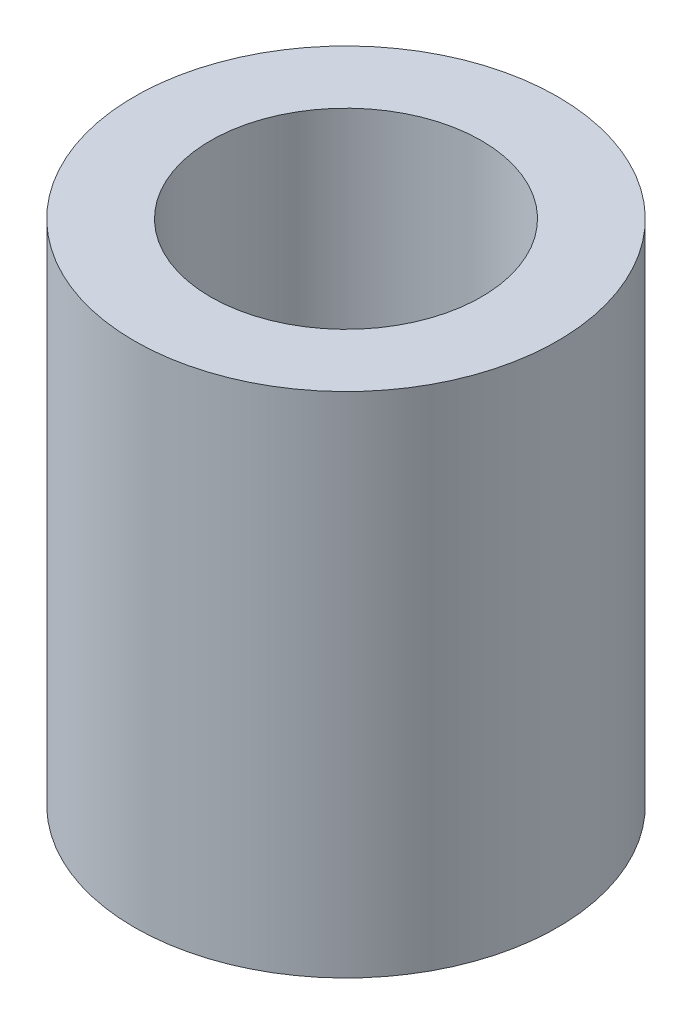
ISO-10303-21;
HEADER;
FILE_DESCRIPTION(('STEP AP214'),'2;1');
FILE_NAME('part.step','',(''),(''),'','','');
FILE_SCHEMA(('AUTOMOTIVE_DESIGN { 1 0 10303 214 1 1 1 1 }'));
ENDSEC;
DATA;
#1=APPLICATION_CONTEXT('core data for automotive mechanical design processes');
#2=APPLICATION_PROTOCOL_DEFINITION('international standard','automotive_design',2000,#1);
#3=PRODUCT_CONTEXT('',#1,'mechanical');
#4=PRODUCT('Part','Part','',(#3));
#5=PRODUCT_RELATED_PRODUCT_CATEGORY('part','',(#4));
#6=PRODUCT_DEFINITION_FORMATION('','',#4);
#7=PRODUCT_DEFINITION_CONTEXT('part definition',#1,'design');
#8=PRODUCT_DEFINITION('design','',#6,#7);
#9=PRODUCT_DEFINITION_SHAPE('','',#8);
#10=(LENGTH_UNIT() NAMED_UNIT(*) SI_UNIT(.MILLI.,.METRE.));
#11=(NAMED_UNIT(*) PLANE_ANGLE_UNIT() SI_UNIT($,.RADIAN.));
#12=(NAMED_UNIT(*) SI_UNIT($,.STERADIAN.) SOLID_ANGLE_UNIT());
#13=UNCERTAINTY_MEASURE_WITH_UNIT(LENGTH_MEASURE(1.E-05),#10,'distance_accuracy_value','');
#14=(GEOMETRIC_REPRESENTATION_CONTEXT(3) GLOBAL_UNCERTAINTY_ASSIGNED_CONTEXT((#13)) GLOBAL_UNIT_ASSIGNED_CONTEXT((#10,
#11,#12)) REPRESENTATION_CONTEXT('',''));
#15=CARTESIAN_POINT('',(0.,0.,0.));
#16=DIRECTION('',(0.,0.,1.));
#17=DIRECTION('',(1.,0.,0.));
#18=AXIS2_PLACEMENT_3D('',#15,#16,#17);
#19=CARTESIAN_POINT('',(0.,30.,0.));
#20=DIRECTION('',(0.,-1.,0.));
#21=DIRECTION('',(0.,0.,-1.));
#22=AXIS2_PLACEMENT_3D('',#19,#20,#21);
#23=CYLINDRICAL_SURFACE('',#22,12.5);
#24=CARTESIAN_POINT('',(0.,30.,0.));
#25=DIRECTION('',(0.,1.,0.));
#26=DIRECTION('',(0.,0.,1.));
#27=AXIS2_PLACEMENT_3D('',#24,#25,#26);
#28=CIRCLE('',#27,12.5);
#29=CARTESIAN_POINT('',(0.,30.,12.5));
#30=VERTEX_POINT('',#29);
#31=EDGE_CURVE('E11',#30,#30,#28,.T.);
#32=ORIENTED_EDGE('',*,*,#31,.F.);
#33=EDGE_LOOP('',(#32));
#34=FACE_BOUND('',#33,.T.);
#35=CARTESIAN_POINT('',(0.,0.,0.));
#36=DIRECTION('',(0.,1.,0.));
#37=DIRECTION('',(0.,0.,1.));
#38=AXIS2_PLACEMENT_3D('',#35,#36,#37);
#39=CIRCLE('',#38,12.5);
#40=CARTESIAN_POINT('',(0.,0.,12.5));
#41=VERTEX_POINT('',#40);
#42=EDGE_CURVE('E36',#41,#41,#39,.T.);
#43=ORIENTED_EDGE('',*,*,#42,.T.);
#44=EDGE_LOOP('',(#43));
#45=FACE_BOUND('',#44,.T.);
#46=ADVANCED_FACE('F33',(#34,#45),#23,.T.);
#47=CARTESIAN_POINT('',(0.,30.,0.));
#48=DIRECTION('',(0.,1.,0.));
#49=DIRECTION('',(0.,0.,1.));
#50=AXIS2_PLACEMENT_3D('',#47,#48,#49);
#51=PLANE('',#50);
#52=CARTESIAN_POINT('',(0.,30.,0.));
#53=DIRECTION('',(0.,1.,0.));
#54=DIRECTION('',(0.,0.,1.));
#55=AXIS2_PLACEMENT_3D('',#52,#53,#54);
#56=CIRCLE('',#55,8.);
#57=CARTESIAN_POINT('',(0.,30.,8.));
#58=VERTEX_POINT('',#57);
#59=EDGE_CURVE('E108',#58,#58,#56,.T.);
#60=ORIENTED_EDGE('',*,*,#59,.F.);
#61=EDGE_LOOP('',(#60));
#62=FACE_BOUND('',#61,.T.);
#63=ORIENTED_EDGE('',*,*,#31,.T.);
#64=EDGE_LOOP('',(#63));
#65=FACE_BOUND('',#64,.T.);
#66=ADVANCED_FACE('F119',(#62,#65),#51,.T.);
#67=CARTESIAN_POINT('',(0.,0.,0.));
#68=DIRECTION('',(0.,1.,0.));
#69=DIRECTION('',(0.,0.,1.));
#70=AXIS2_PLACEMENT_3D('',#67,#68,#69);
#71=PLANE('',#70);
#72=DIRECTION('',(1.,0.,0.));
#73=VECTOR('',#72,1.);
#74=CARTESIAN_POINT('',(-1.5,0.,-2.5));
#75=LINE('',#74,#73);
#76=CARTESIAN_POINT('',(-1.5,0.,-2.5));
#77=VERTEX_POINT('',#76);
#78=CARTESIAN_POINT('',(1.5,0.,-2.5));
#79=VERTEX_POINT('',#78);
#80=EDGE_CURVE('E82',#77,#79,#75,.T.);
#81=ORIENTED_EDGE('',*,*,#80,.F.);
#82=DIRECTION('',(0.,0.,-1.));
#83=VECTOR('',#82,1.);
#84=CARTESIAN_POINT('',(-1.5,0.,2.5));
#85=LINE('',#84,#83);
#86=CARTESIAN_POINT('',(-1.5,0.,2.5));
#87=VERTEX_POINT('',#86);
#88=EDGE_CURVE('E47',#87,#77,#85,.T.);
#89=ORIENTED_EDGE('',*,*,#88,.F.);
#90=DIRECTION('',(-1.,0.,0.));
#91=VECTOR('',#90,1.);
#92=CARTESIAN_POINT('',(-1.5,0.,2.5));
#93=LINE('',#92,#91);
#94=CARTESIAN_POINT('',(1.5,0.,2.5));
#95=VERTEX_POINT('',#94);
#96=EDGE_CURVE('E98',#95,#87,#93,.T.);
#97=ORIENTED_EDGE('',*,*,#96,.F.);
#98=DIRECTION('',(0.,0.,1.));
#99=VECTOR('',#98,1.);
#100=CARTESIAN_POINT('',(1.5,0.,2.5));
#101=LINE('',#100,#99);
#102=EDGE_CURVE('E104',#79,#95,#101,.T.);
#103=ORIENTED_EDGE('',*,*,#102,.F.);
#104=EDGE_LOOP('',(#81,#89,#97,#103));
#105=FACE_BOUND('',#104,.T.);
#106=ORIENTED_EDGE('',*,*,#42,.F.);
#107=EDGE_LOOP('',(#106));
#108=FACE_BOUND('',#107,.T.);
#109=ADVANCED_FACE('F122',(#105,#108),#71,.F.);
#110=CARTESIAN_POINT('',(0.,15.,0.));
#111=DIRECTION('',(0.,1.,0.));
#112=DIRECTION('',(0.,0.,1.));
#113=AXIS2_PLACEMENT_3D('',#110,#111,#112);
#114=CYLINDRICAL_SURFACE('',#113,8.);
#115=CARTESIAN_POINT('',(0.,15.,0.));
#116=DIRECTION('',(0.,1.,0.));
#117=DIRECTION('',(0.,0.,1.));
#118=AXIS2_PLACEMENT_3D('',#115,#116,#117);
#119=CIRCLE('',#118,8.);
#120=CARTESIAN_POINT('',(0.,15.,8.));
#121=VERTEX_POINT('',#120);
#122=EDGE_CURVE('E111',#121,#121,#119,.T.);
#123=ORIENTED_EDGE('',*,*,#122,.F.);
#124=EDGE_LOOP('',(#123));
#125=FACE_BOUND('',#124,.T.);
#126=ORIENTED_EDGE('',*,*,#59,.T.);
#127=EDGE_LOOP('',(#126));
#128=FACE_BOUND('',#127,.T.);
#129=ADVANCED_FACE('F117',(#125,#128),#114,.F.);
#130=CARTESIAN_POINT('',(0.,15.,0.));
#131=DIRECTION('',(0.,1.,0.));
#132=DIRECTION('',(0.,0.,1.));
#133=AXIS2_PLACEMENT_3D('',#130,#131,#132);
#134=PLANE('',#133);
#135=ORIENTED_EDGE('',*,*,#122,.T.);
#136=EDGE_LOOP('',(#135));
#137=FACE_BOUND('',#136,.T.);
#138=ADVANCED_FACE('F136',(#137),#134,.T.);
#139=CARTESIAN_POINT('',(-1.5,6.5,2.5));
#140=DIRECTION('',(-1.,0.,0.));
#141=DIRECTION('',(0.,0.,1.));
#142=AXIS2_PLACEMENT_3D('',#139,#140,#141);
#143=PLANE('',#142);
#144=ORIENTED_EDGE('',*,*,#88,.T.);
#145=DIRECTION('',(0.,-1.,0.));
#146=VECTOR('',#145,1.);
#147=CARTESIAN_POINT('',(-1.5,6.5,-2.5));
#148=LINE('',#147,#146);
#149=CARTESIAN_POINT('',(-1.5,6.5,-2.5));
#150=VERTEX_POINT('',#149);
#151=EDGE_CURVE('E70',#150,#77,#148,.T.);
#152=ORIENTED_EDGE('',*,*,#151,.F.);
#153=DIRECTION('',(0.,0.,-1.));
#154=VECTOR('',#153,1.);
#155=CARTESIAN_POINT('',(-1.5,6.5,2.5));
#156=LINE('',#155,#154);
#157=CARTESIAN_POINT('',(-1.5,6.5,2.5));
#158=VERTEX_POINT('',#157);
#159=EDGE_CURVE('E96',#158,#150,#156,.T.);
#160=ORIENTED_EDGE('',*,*,#159,.F.);
#161=DIRECTION('',(0.,-1.,0.));
#162=VECTOR('',#161,1.);
#163=CARTESIAN_POINT('',(-1.5,6.5,2.5));
#164=LINE('',#163,#162);
#165=EDGE_CURVE('E55',#158,#87,#164,.T.);
#166=ORIENTED_EDGE('',*,*,#165,.T.);
#167=EDGE_LOOP('',(#144,#152,#160,#166));
#168=FACE_BOUND('',#167,.T.);
#169=ADVANCED_FACE('F142',(#168),#143,.F.);
#170=CARTESIAN_POINT('',(-1.5,6.5,2.5));
#171=DIRECTION('',(0.,0.,1.));
#172=DIRECTION('',(1.,0.,0.));
#173=AXIS2_PLACEMENT_3D('',#170,#171,#172);
#174=PLANE('',#173);
#175=ORIENTED_EDGE('',*,*,#96,.T.);
#176=ORIENTED_EDGE('',*,*,#165,.F.);
#177=DIRECTION('',(-1.,0.,0.));
#178=VECTOR('',#177,1.);
#179=CARTESIAN_POINT('',(-1.5,6.5,2.5));
#180=LINE('',#179,#178);
#181=CARTESIAN_POINT('',(1.5,6.5,2.5));
#182=VERTEX_POINT('',#181);
#183=EDGE_CURVE('E93',#182,#158,#180,.T.);
#184=ORIENTED_EDGE('',*,*,#183,.F.);
#185=DIRECTION('',(0.,-1.,0.));
#186=VECTOR('',#185,1.);
#187=CARTESIAN_POINT('',(1.5,6.5,2.5));
#188=LINE('',#187,#186);
#189=EDGE_CURVE('E86',#182,#95,#188,.T.);
#190=ORIENTED_EDGE('',*,*,#189,.T.);
#191=EDGE_LOOP('',(#175,#176,#184,#190));
#192=FACE_BOUND('',#191,.T.);
#193=ADVANCED_FACE('F146',(#192),#174,.F.);
#194=CARTESIAN_POINT('',(1.5,6.5,2.5));
#195=DIRECTION('',(1.,0.,0.));
#196=DIRECTION('',(0.,0.,-1.));
#197=AXIS2_PLACEMENT_3D('',#194,#195,#196);
#198=PLANE('',#197);
#199=ORIENTED_EDGE('',*,*,#102,.T.);
#200=ORIENTED_EDGE('',*,*,#189,.F.);
#201=DIRECTION('',(0.,0.,1.));
#202=VECTOR('',#201,1.);
#203=CARTESIAN_POINT('',(1.5,6.5,2.5));
#204=LINE('',#203,#202);
#205=CARTESIAN_POINT('',(1.5,6.5,-2.5));
#206=VERTEX_POINT('',#205);
#207=EDGE_CURVE('E89',#206,#182,#204,.T.);
#208=ORIENTED_EDGE('',*,*,#207,.F.);
#209=DIRECTION('',(0.,-1.,0.));
#210=VECTOR('',#209,1.);
#211=CARTESIAN_POINT('',(1.5,6.5,-2.5));
#212=LINE('',#211,#210);
#213=EDGE_CURVE('E75',#206,#79,#212,.T.);
#214=ORIENTED_EDGE('',*,*,#213,.T.);
#215=EDGE_LOOP('',(#199,#200,#208,#214));
#216=FACE_BOUND('',#215,.T.);
#217=ADVANCED_FACE('F90',(#216),#198,.F.);
#218=CARTESIAN_POINT('',(-1.5,6.5,-2.5));
#219=DIRECTION('',(0.,0.,-1.));
#220=DIRECTION('',(-1.,0.,0.));
#221=AXIS2_PLACEMENT_3D('',#218,#219,#220);
#222=PLANE('',#221);
#223=ORIENTED_EDGE('',*,*,#80,.T.);
#224=ORIENTED_EDGE('',*,*,#213,.F.);
#225=DIRECTION('',(1.,0.,0.));
#226=VECTOR('',#225,1.);
#227=CARTESIAN_POINT('',(-1.5,6.5,-2.5));
#228=LINE('',#227,#226);
#229=EDGE_CURVE('E79',#150,#206,#228,.T.);
#230=ORIENTED_EDGE('',*,*,#229,.F.);
#231=ORIENTED_EDGE('',*,*,#151,.T.);
#232=EDGE_LOOP('',(#223,#224,#230,#231));
#233=FACE_BOUND('',#232,.T.);
#234=ADVANCED_FACE('F77',(#233),#222,.F.);
#235=CARTESIAN_POINT('',(0.,6.5,0.));
#236=DIRECTION('',(0.,-1.,0.));
#237=DIRECTION('',(0.,0.,-1.));
#238=AXIS2_PLACEMENT_3D('',#235,#236,#237);
#239=PLANE('',#238);
#240=ORIENTED_EDGE('',*,*,#159,.T.);
#241=ORIENTED_EDGE('',*,*,#229,.T.);
#242=ORIENTED_EDGE('',*,*,#207,.T.);
#243=ORIENTED_EDGE('',*,*,#183,.T.);
#244=EDGE_LOOP('',(#240,#241,#242,#243));
#245=FACE_BOUND('',#244,.T.);
#246=ADVANCED_FACE('F95',(#245),#239,.T.);
#247=CLOSED_SHELL('',(#46,#66,#109,#129,#138,#169,#193,#217,#234,#246));
#248=MANIFOLD_SOLID_BREP('B2',#247);
#249=ADVANCED_BREP_SHAPE_REPRESENTATION('',(#18,#248),#14);
#250=SHAPE_DEFINITION_REPRESENTATION(#9,#249);
ENDSEC;
END-ISO-10303-21;
